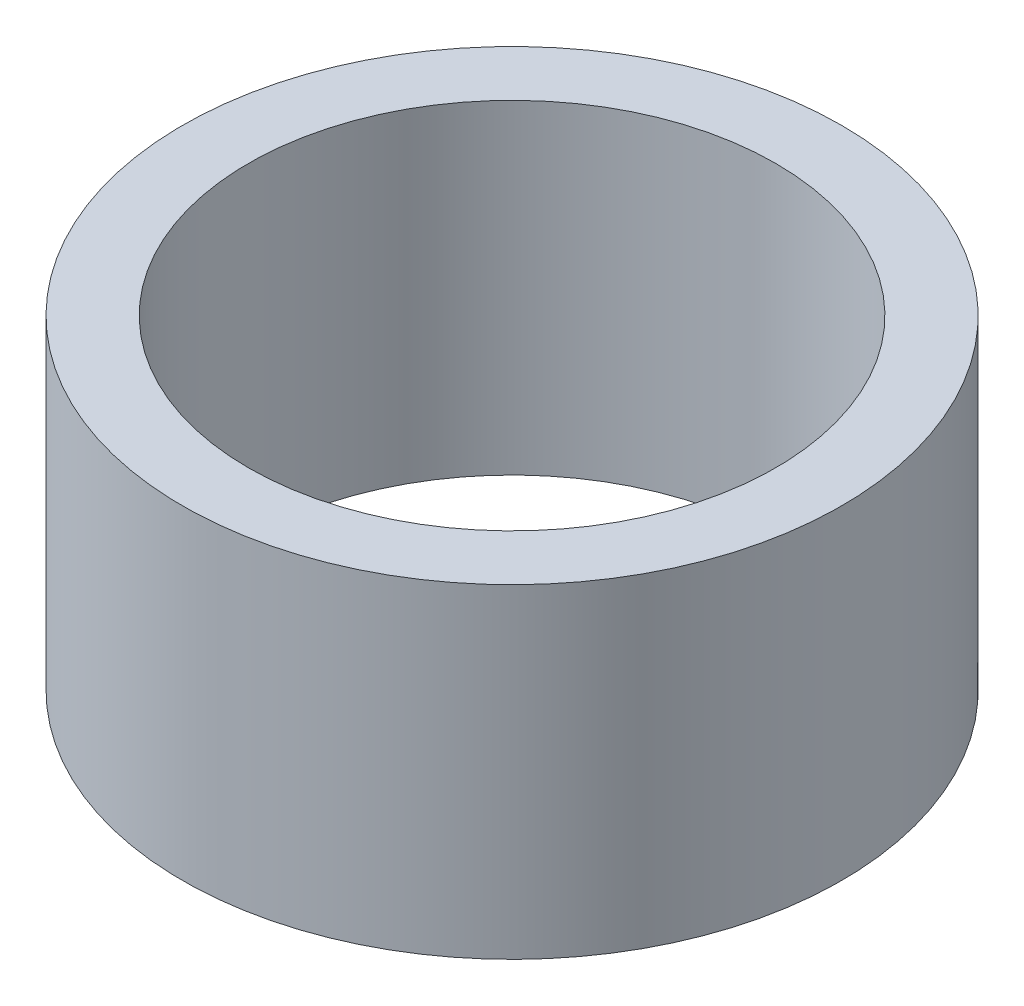
ISO-10303-21;
HEADER;
FILE_DESCRIPTION(('STEP AP214'),'2;1');
FILE_NAME('part.step','',(''),(''),'','','');
FILE_SCHEMA(('AUTOMOTIVE_DESIGN { 1 0 10303 214 1 1 1 1 }'));
ENDSEC;
DATA;
#1=APPLICATION_CONTEXT('core data for automotive mechanical design processes');
#2=APPLICATION_PROTOCOL_DEFINITION('international standard','automotive_design',2000,#1);
#3=PRODUCT_CONTEXT('',#1,'mechanical');
#4=PRODUCT('Part','Part','',(#3));
#5=PRODUCT_RELATED_PRODUCT_CATEGORY('part','',(#4));
#6=PRODUCT_DEFINITION_FORMATION('','',#4);
#7=PRODUCT_DEFINITION_CONTEXT('part definition',#1,'design');
#8=PRODUCT_DEFINITION('design','',#6,#7);
#9=PRODUCT_DEFINITION_SHAPE('','',#8);
#10=(LENGTH_UNIT() NAMED_UNIT(*) SI_UNIT(.MILLI.,.METRE.));
#11=(NAMED_UNIT(*) PLANE_ANGLE_UNIT() SI_UNIT($,.RADIAN.));
#12=(NAMED_UNIT(*) SI_UNIT($,.STERADIAN.) SOLID_ANGLE_UNIT());
#13=UNCERTAINTY_MEASURE_WITH_UNIT(LENGTH_MEASURE(1.E-05),#10,'distance_accuracy_value','');
#14=(GEOMETRIC_REPRESENTATION_CONTEXT(3) GLOBAL_UNCERTAINTY_ASSIGNED_CONTEXT((#13)) GLOBAL_UNIT_ASSIGNED_CONTEXT((#10,
#11,#12)) REPRESENTATION_CONTEXT('',''));
#15=CARTESIAN_POINT('',(0.,0.,0.));
#16=DIRECTION('',(0.,0.,1.));
#17=DIRECTION('',(1.,0.,0.));
#18=AXIS2_PLACEMENT_3D('',#15,#16,#17);
#19=CARTESIAN_POINT('',(20.6375,0.,0.));
#20=DIRECTION('',(0.,-1.,0.));
#21=DIRECTION('',(0.,0.,-1.));
#22=AXIS2_PLACEMENT_3D('',#19,#20,#21);
#23=PLANE('',#22);
#24=CARTESIAN_POINT('',(0.,0.,0.));
#25=DIRECTION('',(0.,-1.,0.));
#26=DIRECTION('',(0.,0.,-1.));
#27=AXIS2_PLACEMENT_3D('',#24,#25,#26);
#28=CIRCLE('',#27,20.6375);
#29=CARTESIAN_POINT('',(0.,0.,-20.6375));
#30=VERTEX_POINT('',#29);
#31=EDGE_CURVE('E45',#30,#30,#28,.T.);
#32=ORIENTED_EDGE('',*,*,#31,.T.);
#33=EDGE_LOOP('',(#32));
#34=FACE_BOUND('',#33,.T.);
#35=CARTESIAN_POINT('',(0.,0.,0.));
#36=DIRECTION('',(0.,-1.,0.));
#37=DIRECTION('',(0.,0.,-1.));
#38=AXIS2_PLACEMENT_3D('',#35,#36,#37);
#39=CIRCLE('',#38,16.51);
#40=CARTESIAN_POINT('',(0.,0.,-16.51));
#41=VERTEX_POINT('',#40);
#42=EDGE_CURVE('E10',#41,#41,#39,.T.);
#43=ORIENTED_EDGE('',*,*,#42,.F.);
#44=EDGE_LOOP('',(#43));
#45=FACE_BOUND('',#44,.T.);
#46=ADVANCED_FACE('F31',(#34,#45),#23,.T.);
#47=CARTESIAN_POINT('',(0.,0.,0.));
#48=DIRECTION('',(0.,-1.,0.));
#49=DIRECTION('',(0.,0.,-1.));
#50=AXIS2_PLACEMENT_3D('',#47,#48,#49);
#51=CYLINDRICAL_SURFACE('',#50,16.51);
#52=ORIENTED_EDGE('',*,*,#42,.T.);
#53=EDGE_LOOP('',(#52));
#54=FACE_BOUND('',#53,.T.);
#55=CARTESIAN_POINT('',(0.,20.32,0.));
#56=DIRECTION('',(0.,-1.,0.));
#57=DIRECTION('',(0.,0.,-1.));
#58=AXIS2_PLACEMENT_3D('',#55,#56,#57);
#59=CIRCLE('',#58,16.51);
#60=CARTESIAN_POINT('',(0.,20.32,-16.51));
#61=VERTEX_POINT('',#60);
#62=EDGE_CURVE('E37',#61,#61,#59,.T.);
#63=ORIENTED_EDGE('',*,*,#62,.F.);
#64=EDGE_LOOP('',(#63));
#65=FACE_BOUND('',#64,.T.);
#66=ADVANCED_FACE('F61',(#54,#65),#51,.F.);
#67=CARTESIAN_POINT('',(16.51,20.32,0.));
#68=DIRECTION('',(0.,1.,0.));
#69=DIRECTION('',(0.,0.,1.));
#70=AXIS2_PLACEMENT_3D('',#67,#68,#69);
#71=PLANE('',#70);
#72=ORIENTED_EDGE('',*,*,#62,.T.);
#73=EDGE_LOOP('',(#72));
#74=FACE_BOUND('',#73,.T.);
#75=CARTESIAN_POINT('',(0.,20.32,0.));
#76=DIRECTION('',(0.,-1.,0.));
#77=DIRECTION('',(0.,0.,-1.));
#78=AXIS2_PLACEMENT_3D('',#75,#76,#77);
#79=CIRCLE('',#78,20.6375);
#80=CARTESIAN_POINT('',(0.,20.32,-20.6375));
#81=VERTEX_POINT('',#80);
#82=EDGE_CURVE('E41',#81,#81,#79,.T.);
#83=ORIENTED_EDGE('',*,*,#82,.F.);
#84=EDGE_LOOP('',(#83));
#85=FACE_BOUND('',#84,.T.);
#86=ADVANCED_FACE('F55',(#74,#85),#71,.T.);
#87=CARTESIAN_POINT('',(0.,0.,0.));
#88=DIRECTION('',(0.,-1.,0.));
#89=DIRECTION('',(0.,0.,-1.));
#90=AXIS2_PLACEMENT_3D('',#87,#88,#89);
#91=CYLINDRICAL_SURFACE('',#90,20.6375);
#92=ORIENTED_EDGE('',*,*,#82,.T.);
#93=EDGE_LOOP('',(#92));
#94=FACE_BOUND('',#93,.T.);
#95=ORIENTED_EDGE('',*,*,#31,.F.);
#96=EDGE_LOOP('',(#95));
#97=FACE_BOUND('',#96,.T.);
#98=ADVANCED_FACE('F53',(#94,#97),#91,.T.);
#99=CLOSED_SHELL('',(#46,#66,#86,#98));
#100=MANIFOLD_SOLID_BREP('B2',#99);
#101=ADVANCED_BREP_SHAPE_REPRESENTATION('',(#18,#100),#14);
#102=SHAPE_DEFINITION_REPRESENTATION(#9,#101);
ENDSEC;
END-ISO-10303-21;
